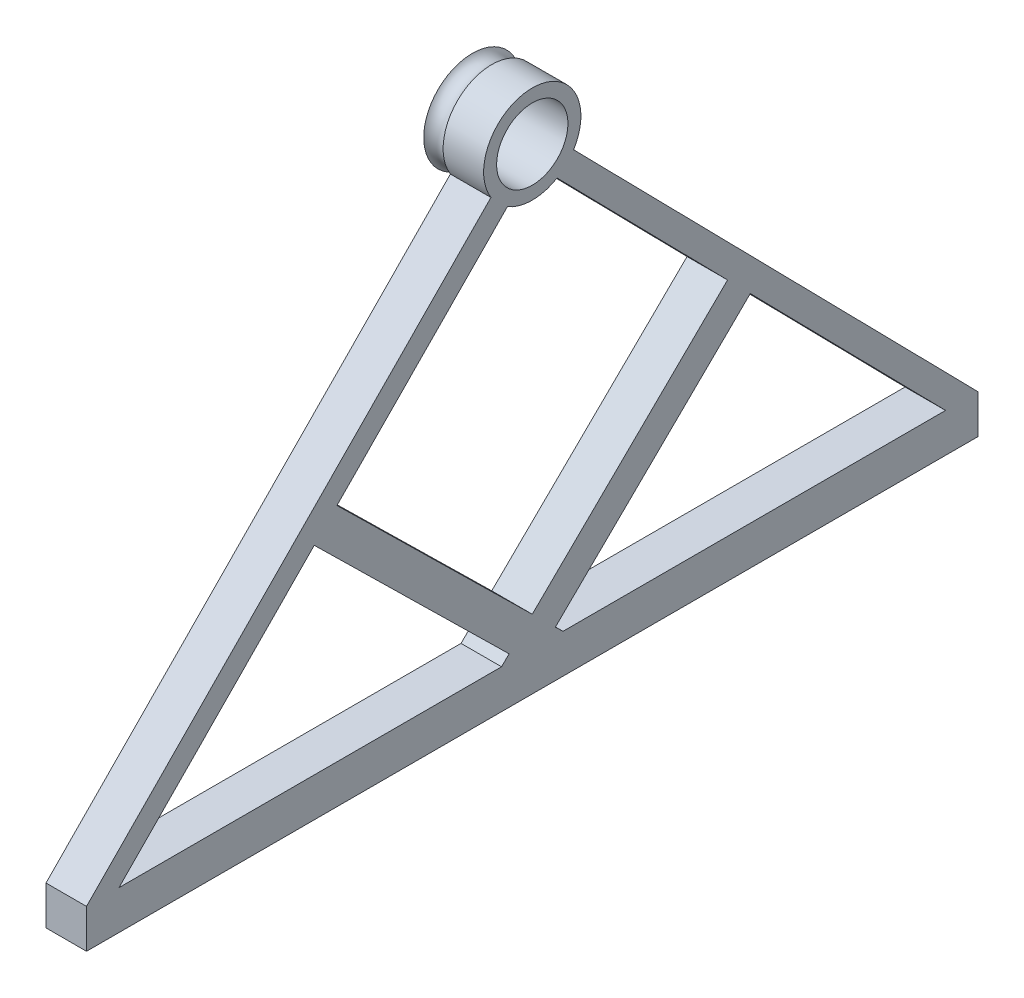
ISO-10303-21;
HEADER;
FILE_DESCRIPTION(('STEP AP214'),'2;1');
FILE_NAME('part.step','',(''),(''),'','','');
FILE_SCHEMA(('AUTOMOTIVE_DESIGN { 1 0 10303 214 1 1 1 1 }'));
ENDSEC;
DATA;
#1=APPLICATION_CONTEXT('core data for automotive mechanical design processes');
#2=APPLICATION_PROTOCOL_DEFINITION('international standard','automotive_design',2000,#1);
#3=PRODUCT_CONTEXT('',#1,'mechanical');
#4=PRODUCT('Part','Part','',(#3));
#5=PRODUCT_RELATED_PRODUCT_CATEGORY('part','',(#4));
#6=PRODUCT_DEFINITION_FORMATION('','',#4);
#7=PRODUCT_DEFINITION_CONTEXT('part definition',#1,'design');
#8=PRODUCT_DEFINITION('design','',#6,#7);
#9=PRODUCT_DEFINITION_SHAPE('','',#8);
#10=(LENGTH_UNIT() NAMED_UNIT(*) SI_UNIT(.MILLI.,.METRE.));
#11=(NAMED_UNIT(*) PLANE_ANGLE_UNIT() SI_UNIT($,.RADIAN.));
#12=(NAMED_UNIT(*) SI_UNIT($,.STERADIAN.) SOLID_ANGLE_UNIT());
#13=UNCERTAINTY_MEASURE_WITH_UNIT(LENGTH_MEASURE(1.E-05),#10,'distance_accuracy_value','');
#14=(GEOMETRIC_REPRESENTATION_CONTEXT(3) GLOBAL_UNCERTAINTY_ASSIGNED_CONTEXT((#13)) GLOBAL_UNIT_ASSIGNED_CONTEXT((#10,
#11,#12)) REPRESENTATION_CONTEXT('',''));
#15=CARTESIAN_POINT('',(0.,0.,0.));
#16=DIRECTION('',(0.,0.,1.));
#17=DIRECTION('',(1.,0.,0.));
#18=AXIS2_PLACEMENT_3D('',#15,#16,#17);
#19=CARTESIAN_POINT('',(152.5,12.,125.));
#20=DIRECTION('',(-1.,0.,0.));
#21=DIRECTION('',(0.,0.,1.));
#22=AXIS2_PLACEMENT_3D('',#19,#20,#21);
#23=PLANE('',#22);
#24=DIRECTION('',(0.,0.713448160609422,-0.700708014884254));
#25=VECTOR('',#24,1.);
#26=CARTESIAN_POINT('',(152.5,12.,127.5));
#27=LINE('',#26,#25);
#28=CARTESIAN_POINT('',(152.5,12.,127.5));
#29=VERTEX_POINT('',#28);
#30=CARTESIAN_POINT('',(152.5,73.3418501060439,67.2535400744212));
#31=VERTEX_POINT('',#30);
#32=EDGE_CURVE('E296',#29,#31,#27,.T.);
#33=ORIENTED_EDGE('',*,*,#32,.F.);
#34=DIRECTION('',(0.,0.,-1.));
#35=VECTOR('',#34,1.);
#36=CARTESIAN_POINT('',(152.5,12.,125.));
#37=LINE('',#36,#35);
#38=CARTESIAN_POINT('',(152.5,12.,9.47489599950741));
#39=VERTEX_POINT('',#38);
#40=EDGE_CURVE('E199',#29,#39,#37,.T.);
#41=ORIENTED_EDGE('',*,*,#40,.T.);
#42=DIRECTION('',(0.,0.700708014884254,-0.713448160609422));
#43=VECTOR('',#42,1.);
#44=CARTESIAN_POINT('',(152.5,1.95493491441996,19.702598632098));
#45=LINE('',#44,#43);
#46=CARTESIAN_POINT('',(152.5,14.2974837662339,7.13563980116018));
#47=VERTEX_POINT('',#46);
#48=EDGE_CURVE('E237',#39,#47,#45,.T.);
#49=ORIENTED_EDGE('',*,*,#48,.T.);
#50=DIRECTION('',(0.,0.700708014884254,0.713448160609422));
#51=VECTOR('',#50,1.);
#52=CARTESIAN_POINT('',(152.5,-5.17954669167424,-12.6955184832554));
#53=LINE('',#52,#51);
#54=EDGE_CURVE('E250',#47,#31,#53,.T.);
#55=ORIENTED_EDGE('',*,*,#54,.T.);
#56=EDGE_LOOP('',(#33,#41,#49,#55));
#57=FACE_BOUND('',#56,.T.);
#58=DIRECTION('',(0.,0.713448160609422,0.700708014884254));
#59=VECTOR('',#58,1.);
#60=CARTESIAN_POINT('',(152.5,152.,0.));
#61=LINE('',#60,#59);
#62=CARTESIAN_POINT('',(152.5,12.,-137.5));
#63=VERTEX_POINT('',#62);
#64=CARTESIAN_POINT('',(152.5,139.013992886752,-12.7541141290826));
#65=VERTEX_POINT('',#64);
#66=EDGE_CURVE('E181',#63,#65,#61,.T.);
#67=ORIENTED_EDGE('',*,*,#66,.F.);
#68=DIRECTION('',(0.,-1.,0.));
#69=VECTOR('',#68,1.);
#70=CARTESIAN_POINT('',(152.5,0.,-137.5));
#71=LINE('',#70,#69);
#72=CARTESIAN_POINT('',(152.5,0.,-137.5));
#73=VERTEX_POINT('',#72);
#74=EDGE_CURVE('E184',#63,#73,#71,.T.);
#75=ORIENTED_EDGE('',*,*,#74,.T.);
#76=DIRECTION('',(0.,0.,-1.));
#77=VECTOR('',#76,1.);
#78=CARTESIAN_POINT('',(152.5,0.,125.));
#79=LINE('',#78,#77);
#80=CARTESIAN_POINT('',(152.5,0.,137.5));
#81=VERTEX_POINT('',#80);
#82=EDGE_CURVE('E169',#81,#73,#79,.T.);
#83=ORIENTED_EDGE('',*,*,#82,.F.);
#84=DIRECTION('',(0.,-1.,0.));
#85=VECTOR('',#84,1.);
#86=CARTESIAN_POINT('',(152.5,12.,137.5));
#87=LINE('',#86,#85);
#88=CARTESIAN_POINT('',(152.5,12.,137.5));
#89=VERTEX_POINT('',#88);
#90=EDGE_CURVE('E189',#89,#81,#87,.T.);
#91=ORIENTED_EDGE('',*,*,#90,.F.);
#92=DIRECTION('',(0.,-0.713448160609422,0.700708014884254));
#93=VECTOR('',#92,1.);
#94=CARTESIAN_POINT('',(152.5,152.,0.));
#95=LINE('',#94,#93);
#96=CARTESIAN_POINT('',(152.5,139.013992886752,12.7541141290826));
#97=VERTEX_POINT('',#96);
#98=EDGE_CURVE('E281',#97,#89,#95,.T.);
#99=ORIENTED_EDGE('',*,*,#98,.F.);
#100=CARTESIAN_POINT('',(152.5,146.909090909091,0.));
#101=DIRECTION('',(1.,0.,0.));
#102=DIRECTION('',(0.,0.,-1.));
#103=AXIS2_PLACEMENT_3D('',#100,#101,#102);
#104=CIRCLE('',#103,15.);
#105=CARTESIAN_POINT('',(152.5,134.014804443318,7.66403135031291));
#106=VERTEX_POINT('',#105);
#107=EDGE_CURVE('E328',#97,#106,#104,.T.);
#108=ORIENTED_EDGE('',*,*,#107,.T.);
#109=CARTESIAN_POINT('',(152.5,80.4763317121381,60.2464599255787));
#110=VERTEX_POINT('',#109);
#111=EDGE_CURVE('E299',#110,#106,#27,.T.);
#112=ORIENTED_EDGE('',*,*,#111,.F.);
#113=DIRECTION('',(0.,0.700708014884254,0.713448160609422));
#114=VECTOR('',#113,1.);
#115=CARTESIAN_POINT('',(152.5,1.95493491441998,-19.7025986320979));
#116=LINE('',#115,#114);
#117=CARTESIAN_POINT('',(152.5,21.3057014280876,0.));
#118=VERTEX_POINT('',#117);
#119=EDGE_CURVE('E254',#118,#110,#116,.T.);
#120=ORIENTED_EDGE('',*,*,#119,.F.);
#121=CARTESIAN_POINT('',(152.5,80.4763317121381,-60.2464599255786));
#122=VERTEX_POINT('',#121);
#123=EDGE_CURVE('E228',#118,#122,#45,.T.);
#124=ORIENTED_EDGE('',*,*,#123,.T.);
#125=DIRECTION('',(0.,-0.713448160609422,-0.700708014884254));
#126=VECTOR('',#125,1.);
#127=CARTESIAN_POINT('',(152.5,141.818181818182,0.));
#128=LINE('',#127,#126);
#129=CARTESIAN_POINT('',(152.5,134.014804443318,-7.6640313503129));
#130=VERTEX_POINT('',#129);
#131=EDGE_CURVE('E294',#130,#122,#128,.T.);
#132=ORIENTED_EDGE('',*,*,#131,.F.);
#133=EDGE_CURVE('E326',#130,#65,#104,.T.);
#134=ORIENTED_EDGE('',*,*,#133,.T.);
#135=EDGE_LOOP('',(#67,#75,#83,#91,#99,#108,#112,#120,#124,#132,#134));
#136=FACE_BOUND('',#135,.T.);
#137=CARTESIAN_POINT('',(152.5,12.,-9.47489599950734));
#138=VERTEX_POINT('',#137);
#139=CARTESIAN_POINT('',(152.5,12.,-127.5));
#140=VERTEX_POINT('',#139);
#141=EDGE_CURVE('E180',#138,#140,#37,.T.);
#142=ORIENTED_EDGE('',*,*,#141,.T.);
#143=CARTESIAN_POINT('',(152.5,73.3418501060439,-67.2535400744212));
#144=VERTEX_POINT('',#143);
#145=EDGE_CURVE('E225',#144,#140,#128,.T.);
#146=ORIENTED_EDGE('',*,*,#145,.F.);
#147=DIRECTION('',(0.,0.700708014884254,-0.713448160609422));
#148=VECTOR('',#147,1.);
#149=CARTESIAN_POINT('',(152.5,-5.17954669167427,12.6955184832554));
#150=LINE('',#149,#148);
#151=CARTESIAN_POINT('',(152.5,14.2974837662339,-7.13563980116013));
#152=VERTEX_POINT('',#151);
#153=EDGE_CURVE('E217',#152,#144,#150,.T.);
#154=ORIENTED_EDGE('',*,*,#153,.F.);
#155=EDGE_CURVE('E222',#138,#152,#116,.T.);
#156=ORIENTED_EDGE('',*,*,#155,.F.);
#157=EDGE_LOOP('',(#142,#146,#154,#156));
#158=FACE_BOUND('',#157,.T.);
#159=ADVANCED_FACE('F36',(#57,#136,#158),#23,.T.);
#160=CARTESIAN_POINT('',(-156.085482484189,141.818181818182,0.));
#161=DIRECTION('',(0.,-0.700708014884254,0.713448160609422));
#162=DIRECTION('',(0.,-0.713448160609422,-0.700708014884254));
#163=AXIS2_PLACEMENT_3D('',#160,#161,#162);
#164=PLANE('',#163);
#165=DIRECTION('',(0.,-0.713448160609422,-0.700708014884254));
#166=VECTOR('',#165,1.);
#167=CARTESIAN_POINT('',(165.,141.818181818182,0.));
#168=LINE('',#167,#166);
#169=CARTESIAN_POINT('',(165.,73.3418501060439,-67.2535400744212));
#170=VERTEX_POINT('',#169);
#171=CARTESIAN_POINT('',(165.,12.,-127.5));
#172=VERTEX_POINT('',#171);
#173=EDGE_CURVE('E51',#170,#172,#168,.T.);
#174=ORIENTED_EDGE('',*,*,#173,.F.);
#175=DIRECTION('',(1.,0.,0.));
#176=VECTOR('',#175,1.);
#177=CARTESIAN_POINT('',(0.,73.3418501060439,-67.2535400744212));
#178=LINE('',#177,#176);
#179=EDGE_CURVE('E226',#144,#170,#178,.T.);
#180=ORIENTED_EDGE('',*,*,#179,.F.);
#181=ORIENTED_EDGE('',*,*,#145,.T.);
#182=DIRECTION('',(1.,0.,0.));
#183=VECTOR('',#182,1.);
#184=CARTESIAN_POINT('',(-156.085482484189,12.,-127.5));
#185=LINE('',#184,#183);
#186=EDGE_CURVE('E293',#140,#172,#185,.T.);
#187=ORIENTED_EDGE('',*,*,#186,.T.);
#188=EDGE_LOOP('',(#174,#180,#181,#187));
#189=FACE_BOUND('',#188,.T.);
#190=ADVANCED_FACE('F375',(#189),#164,.T.);
#191=CARTESIAN_POINT('',(0.,1.95493491441998,-19.7025986320979));
#192=DIRECTION('',(0.,-0.713448160609422,0.700708014884254));
#193=DIRECTION('',(0.,-0.700708014884254,-0.713448160609422));
#194=AXIS2_PLACEMENT_3D('',#191,#192,#193);
#195=PLANE('',#194);
#196=DIRECTION('',(-1.,0.,0.));
#197=VECTOR('',#196,1.);
#198=CARTESIAN_POINT('',(0.,14.2974837662339,-7.13563980116013));
#199=LINE('',#198,#197);
#200=CARTESIAN_POINT('',(165.,14.2974837662339,-7.13563980116013));
#201=VERTEX_POINT('',#200);
#202=EDGE_CURVE('E44',#201,#152,#199,.T.);
#203=ORIENTED_EDGE('',*,*,#202,.F.);
#204=DIRECTION('',(0.,0.700708014884254,0.713448160609422));
#205=VECTOR('',#204,1.);
#206=CARTESIAN_POINT('',(165.,1.95493491442002,-19.7025986320979));
#207=LINE('',#206,#205);
#208=CARTESIAN_POINT('',(165.,12.,-9.47489599950735));
#209=VERTEX_POINT('',#208);
#210=EDGE_CURVE('E255',#209,#201,#207,.T.);
#211=ORIENTED_EDGE('',*,*,#210,.F.);
#212=DIRECTION('',(1.,0.,0.));
#213=VECTOR('',#212,1.);
#214=CARTESIAN_POINT('',(0.,12.,-9.47489599950734));
#215=LINE('',#214,#213);
#216=EDGE_CURVE('E242',#138,#209,#215,.T.);
#217=ORIENTED_EDGE('',*,*,#216,.F.);
#218=ORIENTED_EDGE('',*,*,#155,.T.);
#219=EDGE_LOOP('',(#203,#211,#217,#218));
#220=FACE_BOUND('',#219,.T.);
#221=ADVANCED_FACE('F382',(#220),#195,.F.);
#222=CARTESIAN_POINT('',(0.,12.,0.));
#223=DIRECTION('',(0.,-1.,0.));
#224=DIRECTION('',(0.,0.,-1.));
#225=AXIS2_PLACEMENT_3D('',#222,#223,#224);
#226=PLANE('',#225);
#227=ORIENTED_EDGE('',*,*,#40,.F.);
#228=DIRECTION('',(1.,0.,0.));
#229=VECTOR('',#228,1.);
#230=CARTESIAN_POINT('',(-156.085482484189,12.,127.5));
#231=LINE('',#230,#229);
#232=CARTESIAN_POINT('',(165.,12.,127.5));
#233=VERTEX_POINT('',#232);
#234=EDGE_CURVE('E301',#29,#233,#231,.T.);
#235=ORIENTED_EDGE('',*,*,#234,.T.);
#236=DIRECTION('',(0.,0.,-1.));
#237=VECTOR('',#236,1.);
#238=CARTESIAN_POINT('',(165.,12.,137.5));
#239=LINE('',#238,#237);
#240=CARTESIAN_POINT('',(165.,12.,9.47489599950741));
#241=VERTEX_POINT('',#240);
#242=EDGE_CURVE('E307',#233,#241,#239,.T.);
#243=ORIENTED_EDGE('',*,*,#242,.T.);
#244=DIRECTION('',(1.,0.,0.));
#245=VECTOR('',#244,1.);
#246=CARTESIAN_POINT('',(0.,12.,9.47489599950728));
#247=LINE('',#246,#245);
#248=EDGE_CURVE('E233',#39,#241,#247,.T.);
#249=ORIENTED_EDGE('',*,*,#248,.F.);
#250=EDGE_LOOP('',(#227,#235,#243,#249));
#251=FACE_BOUND('',#250,.T.);
#252=ADVANCED_FACE('F393',(#251),#226,.F.);
#253=CARTESIAN_POINT('',(-156.085482484189,12.,127.5));
#254=DIRECTION('',(0.,-0.700708014884254,-0.713448160609422));
#255=DIRECTION('',(0.,0.713448160609422,-0.700708014884254));
#256=AXIS2_PLACEMENT_3D('',#253,#254,#255);
#257=PLANE('',#256);
#258=DIRECTION('',(0.,0.713448160609422,-0.700708014884254));
#259=VECTOR('',#258,1.);
#260=CARTESIAN_POINT('',(165.,12.,127.5));
#261=LINE('',#260,#259);
#262=CARTESIAN_POINT('',(165.,80.4763317121381,60.2464599255786));
#263=VERTEX_POINT('',#262);
#264=CARTESIAN_POINT('',(165.,134.014804443318,7.66403135031291));
#265=VERTEX_POINT('',#264);
#266=EDGE_CURVE('E285',#263,#265,#261,.T.);
#267=ORIENTED_EDGE('',*,*,#266,.F.);
#268=DIRECTION('',(1.,0.,0.));
#269=VECTOR('',#268,1.);
#270=CARTESIAN_POINT('',(0.,80.4763317121381,60.2464599255787));
#271=LINE('',#270,#269);
#272=EDGE_CURVE('E247',#110,#263,#271,.T.);
#273=ORIENTED_EDGE('',*,*,#272,.F.);
#274=ORIENTED_EDGE('',*,*,#111,.T.);
#275=DIRECTION('',(-1.,0.,0.));
#276=VECTOR('',#275,1.);
#277=CARTESIAN_POINT('',(207.426406871193,134.014804443318,7.66403135031289));
#278=LINE('',#277,#276);
#279=EDGE_CURVE('E273',#265,#106,#278,.T.);
#280=ORIENTED_EDGE('',*,*,#279,.F.);
#281=EDGE_LOOP('',(#267,#273,#274,#280));
#282=FACE_BOUND('',#281,.T.);
#283=ADVANCED_FACE('F391',(#282),#257,.T.);
#284=ORIENTED_EDGE('',*,*,#186,.F.);
#285=ORIENTED_EDGE('',*,*,#141,.F.);
#286=ORIENTED_EDGE('',*,*,#216,.T.);
#287=EDGE_CURVE('E197',#209,#172,#239,.T.);
#288=ORIENTED_EDGE('',*,*,#287,.T.);
#289=EDGE_LOOP('',(#284,#285,#286,#288));
#290=FACE_BOUND('',#289,.T.);
#291=ADVANCED_FACE('F388',(#290),#226,.F.);
#292=CARTESIAN_POINT('',(0.,0.,0.));
#293=DIRECTION('',(0.,-1.,0.));
#294=DIRECTION('',(0.,0.,-1.));
#295=AXIS2_PLACEMENT_3D('',#292,#293,#294);
#296=PLANE('',#295);
#297=ORIENTED_EDGE('',*,*,#82,.T.);
#298=DIRECTION('',(-1.,0.,0.));
#299=VECTOR('',#298,1.);
#300=CARTESIAN_POINT('',(-165.,0.,-137.5));
#301=LINE('',#300,#299);
#302=CARTESIAN_POINT('',(165.,0.,-137.5));
#303=VERTEX_POINT('',#302);
#304=EDGE_CURVE('E174',#303,#73,#301,.T.);
#305=ORIENTED_EDGE('',*,*,#304,.F.);
#306=DIRECTION('',(0.,0.,-1.));
#307=VECTOR('',#306,1.);
#308=CARTESIAN_POINT('',(165.,0.,137.5));
#309=LINE('',#308,#307);
#310=CARTESIAN_POINT('',(165.,0.,137.5));
#311=VERTEX_POINT('',#310);
#312=EDGE_CURVE('E195',#311,#303,#309,.T.);
#313=ORIENTED_EDGE('',*,*,#312,.F.);
#314=DIRECTION('',(1.,0.,0.));
#315=VECTOR('',#314,1.);
#316=CARTESIAN_POINT('',(-165.,0.,137.5));
#317=LINE('',#316,#315);
#318=EDGE_CURVE('E176',#81,#311,#317,.T.);
#319=ORIENTED_EDGE('',*,*,#318,.F.);
#320=EDGE_LOOP('',(#297,#305,#313,#319));
#321=FACE_BOUND('',#320,.T.);
#322=ADVANCED_FACE('F171',(#321),#296,.T.);
#323=CARTESIAN_POINT('',(165.,12.,137.5));
#324=DIRECTION('',(-1.,0.,0.));
#325=DIRECTION('',(0.,0.,1.));
#326=AXIS2_PLACEMENT_3D('',#323,#324,#325);
#327=PLANE('',#326);
#328=DIRECTION('',(0.,0.700708014884254,-0.713448160609422));
#329=VECTOR('',#328,1.);
#330=CARTESIAN_POINT('',(165.,1.95493491441998,19.702598632098));
#331=LINE('',#330,#329);
#332=CARTESIAN_POINT('',(165.,14.2974837662339,7.13563980116018));
#333=VERTEX_POINT('',#332);
#334=EDGE_CURVE('E230',#241,#333,#331,.T.);
#335=ORIENTED_EDGE('',*,*,#334,.F.);
#336=ORIENTED_EDGE('',*,*,#242,.F.);
#337=CARTESIAN_POINT('',(165.,73.3418501060439,67.2535400744212));
#338=VERTEX_POINT('',#337);
#339=EDGE_CURVE('E282',#233,#338,#261,.T.);
#340=ORIENTED_EDGE('',*,*,#339,.T.);
#341=DIRECTION('',(0.,0.700708014884254,0.713448160609422));
#342=VECTOR('',#341,1.);
#343=CARTESIAN_POINT('',(165.,-5.17954669167424,-12.6955184832554));
#344=LINE('',#343,#342);
#345=EDGE_CURVE('E246',#333,#338,#344,.T.);
#346=ORIENTED_EDGE('',*,*,#345,.F.);
#347=EDGE_LOOP('',(#335,#336,#340,#346));
#348=FACE_BOUND('',#347,.T.);
#349=CARTESIAN_POINT('',(165.,21.3057014280876,0.));
#350=VERTEX_POINT('',#349);
#351=CARTESIAN_POINT('',(165.,80.4763317121381,-60.2464599255786));
#352=VERTEX_POINT('',#351);
#353=EDGE_CURVE('E236',#350,#352,#331,.T.);
#354=ORIENTED_EDGE('',*,*,#353,.F.);
#355=EDGE_CURVE('E257',#350,#263,#207,.T.);
#356=ORIENTED_EDGE('',*,*,#355,.T.);
#357=ORIENTED_EDGE('',*,*,#266,.T.);
#358=CARTESIAN_POINT('',(165.,146.909090909091,0.));
#359=DIRECTION('',(-1.,0.,0.));
#360=DIRECTION('',(0.,0.,1.));
#361=AXIS2_PLACEMENT_3D('',#358,#359,#360);
#362=CIRCLE('',#361,15.);
#363=CARTESIAN_POINT('',(165.,134.014804443318,-7.66403135031291));
#364=VERTEX_POINT('',#363);
#365=EDGE_CURVE('E263',#265,#364,#362,.F.);
#366=ORIENTED_EDGE('',*,*,#365,.T.);
#367=EDGE_CURVE('E279',#364,#352,#168,.T.);
#368=ORIENTED_EDGE('',*,*,#367,.T.);
#369=EDGE_LOOP('',(#354,#356,#357,#366,#368));
#370=FACE_BOUND('',#369,.T.);
#371=ORIENTED_EDGE('',*,*,#210,.T.);
#372=DIRECTION('',(0.,0.700708014884254,-0.713448160609422));
#373=VECTOR('',#372,1.);
#374=CARTESIAN_POINT('',(165.,-5.17954669167425,12.6955184832554));
#375=LINE('',#374,#373);
#376=EDGE_CURVE('E218',#201,#170,#375,.T.);
#377=ORIENTED_EDGE('',*,*,#376,.T.);
#378=ORIENTED_EDGE('',*,*,#173,.T.);
#379=ORIENTED_EDGE('',*,*,#287,.F.);
#380=EDGE_LOOP('',(#371,#377,#378,#379));
#381=FACE_BOUND('',#380,.T.);
#382=DIRECTION('',(0.,0.713448160609422,0.700708014884254));
#383=VECTOR('',#382,1.);
#384=CARTESIAN_POINT('',(165.,152.,0.));
#385=LINE('',#384,#383);
#386=CARTESIAN_POINT('',(165.,12.,-137.5));
#387=VERTEX_POINT('',#386);
#388=CARTESIAN_POINT('',(165.,139.013992886752,-12.7541141290826));
#389=VERTEX_POINT('',#388);
#390=EDGE_CURVE('E278',#387,#389,#385,.T.);
#391=ORIENTED_EDGE('',*,*,#390,.T.);
#392=CARTESIAN_POINT('',(165.,139.013992886752,12.7541141290826));
#393=VERTEX_POINT('',#392);
#394=EDGE_CURVE('E261',#389,#393,#362,.F.);
#395=ORIENTED_EDGE('',*,*,#394,.T.);
#396=DIRECTION('',(0.,-0.713448160609422,0.700708014884254));
#397=VECTOR('',#396,1.);
#398=CARTESIAN_POINT('',(165.,152.,0.));
#399=LINE('',#398,#397);
#400=CARTESIAN_POINT('',(165.,12.,137.5));
#401=VERTEX_POINT('',#400);
#402=EDGE_CURVE('E286',#393,#401,#399,.T.);
#403=ORIENTED_EDGE('',*,*,#402,.T.);
#404=DIRECTION('',(0.,-1.,0.));
#405=VECTOR('',#404,1.);
#406=CARTESIAN_POINT('',(165.,12.,137.5));
#407=LINE('',#406,#405);
#408=EDGE_CURVE('E203',#401,#311,#407,.T.);
#409=ORIENTED_EDGE('',*,*,#408,.T.);
#410=ORIENTED_EDGE('',*,*,#312,.T.);
#411=DIRECTION('',(0.,-1.,0.));
#412=VECTOR('',#411,1.);
#413=CARTESIAN_POINT('',(165.,12.,-137.5));
#414=LINE('',#413,#412);
#415=EDGE_CURVE('E193',#387,#303,#414,.T.);
#416=ORIENTED_EDGE('',*,*,#415,.F.);
#417=EDGE_LOOP('',(#391,#395,#403,#409,#410,#416));
#418=FACE_BOUND('',#417,.T.);
#419=CARTESIAN_POINT('',(165.,146.909090909091,0.));
#420=DIRECTION('',(-1.,0.,0.));
#421=DIRECTION('',(0.,0.,1.));
#422=AXIS2_PLACEMENT_3D('',#419,#420,#421);
#423=CIRCLE('',#422,11.);
#424=CARTESIAN_POINT('',(165.,146.909090909091,11.));
#425=VERTEX_POINT('',#424);
#426=EDGE_CURVE('E267',#425,#425,#423,.F.);
#427=ORIENTED_EDGE('',*,*,#426,.F.);
#428=EDGE_LOOP('',(#427));
#429=FACE_BOUND('',#428,.T.);
#430=ADVANCED_FACE('F38',(#348,#370,#381,#418,#429),#327,.F.);
#431=CARTESIAN_POINT('',(-165.,12.,-137.5));
#432=DIRECTION('',(0.,0.,1.));
#433=DIRECTION('',(1.,0.,0.));
#434=AXIS2_PLACEMENT_3D('',#431,#432,#433);
#435=PLANE('',#434);
#436=ORIENTED_EDGE('',*,*,#304,.T.);
#437=ORIENTED_EDGE('',*,*,#74,.F.);
#438=DIRECTION('',(-1.,0.,0.));
#439=VECTOR('',#438,1.);
#440=CARTESIAN_POINT('',(-165.,12.,-137.5));
#441=LINE('',#440,#439);
#442=EDGE_CURVE('E206',#387,#63,#441,.T.);
#443=ORIENTED_EDGE('',*,*,#442,.F.);
#444=ORIENTED_EDGE('',*,*,#415,.T.);
#445=EDGE_LOOP('',(#436,#437,#443,#444));
#446=FACE_BOUND('',#445,.T.);
#447=ADVANCED_FACE('F191',(#446),#435,.F.);
#448=CARTESIAN_POINT('',(-165.,12.,137.5));
#449=DIRECTION('',(0.,0.,-1.));
#450=DIRECTION('',(-1.,0.,0.));
#451=AXIS2_PLACEMENT_3D('',#448,#449,#450);
#452=PLANE('',#451);
#453=DIRECTION('',(1.,0.,0.));
#454=VECTOR('',#453,1.);
#455=CARTESIAN_POINT('',(-156.085482484189,12.,137.5));
#456=LINE('',#455,#454);
#457=EDGE_CURVE('E291',#89,#401,#456,.T.);
#458=ORIENTED_EDGE('',*,*,#457,.F.);
#459=ORIENTED_EDGE('',*,*,#90,.T.);
#460=ORIENTED_EDGE('',*,*,#318,.T.);
#461=ORIENTED_EDGE('',*,*,#408,.F.);
#462=EDGE_LOOP('',(#458,#459,#460,#461));
#463=FACE_BOUND('',#462,.T.);
#464=ADVANCED_FACE('F319',(#463),#452,.F.);
#465=CARTESIAN_POINT('',(-156.085482484189,152.,0.));
#466=DIRECTION('',(0.,0.700708014884254,0.713448160609422));
#467=DIRECTION('',(0.,-0.713448160609422,0.700708014884254));
#468=AXIS2_PLACEMENT_3D('',#465,#466,#467);
#469=PLANE('',#468);
#470=DIRECTION('',(-1.,0.,0.));
#471=VECTOR('',#470,1.);
#472=CARTESIAN_POINT('',(207.426406871193,139.013992886752,12.7541141290826));
#473=LINE('',#472,#471);
#474=EDGE_CURVE('E275',#97,#393,#473,.F.);
#475=ORIENTED_EDGE('',*,*,#474,.F.);
#476=ORIENTED_EDGE('',*,*,#98,.T.);
#477=ORIENTED_EDGE('',*,*,#457,.T.);
#478=ORIENTED_EDGE('',*,*,#402,.F.);
#479=EDGE_LOOP('',(#475,#476,#477,#478));
#480=FACE_BOUND('',#479,.T.);
#481=ADVANCED_FACE('F322',(#480),#469,.T.);
#482=DIRECTION('',(1.,0.,0.));
#483=VECTOR('',#482,1.);
#484=CARTESIAN_POINT('',(0.,73.3418501060439,67.2535400744212));
#485=LINE('',#484,#483);
#486=EDGE_CURVE('E243',#31,#338,#485,.T.);
#487=ORIENTED_EDGE('',*,*,#486,.T.);
#488=ORIENTED_EDGE('',*,*,#339,.F.);
#489=ORIENTED_EDGE('',*,*,#234,.F.);
#490=ORIENTED_EDGE('',*,*,#32,.T.);
#491=EDGE_LOOP('',(#487,#488,#489,#490));
#492=FACE_BOUND('',#491,.T.);
#493=ADVANCED_FACE('F416',(#492),#257,.T.);
#494=DIRECTION('',(1.,0.,0.));
#495=VECTOR('',#494,1.);
#496=CARTESIAN_POINT('',(0.,80.4763317121381,-60.2464599255787));
#497=LINE('',#496,#495);
#498=EDGE_CURVE('E59',#122,#352,#497,.T.);
#499=ORIENTED_EDGE('',*,*,#498,.T.);
#500=ORIENTED_EDGE('',*,*,#367,.F.);
#501=DIRECTION('',(-1.,0.,0.));
#502=VECTOR('',#501,1.);
#503=CARTESIAN_POINT('',(207.426406871193,134.014804443318,-7.6640313503129));
#504=LINE('',#503,#502);
#505=EDGE_CURVE('E270',#130,#364,#504,.F.);
#506=ORIENTED_EDGE('',*,*,#505,.F.);
#507=ORIENTED_EDGE('',*,*,#131,.T.);
#508=EDGE_LOOP('',(#499,#500,#506,#507));
#509=FACE_BOUND('',#508,.T.);
#510=ADVANCED_FACE('F351',(#509),#164,.T.);
#511=CARTESIAN_POINT('',(-156.085482484189,152.,0.));
#512=DIRECTION('',(0.,0.700708014884254,-0.713448160609422));
#513=DIRECTION('',(0.,0.713448160609422,0.700708014884254));
#514=AXIS2_PLACEMENT_3D('',#511,#512,#513);
#515=PLANE('',#514);
#516=DIRECTION('',(-1.,0.,0.));
#517=VECTOR('',#516,1.);
#518=CARTESIAN_POINT('',(207.426406871193,139.013992886752,-12.7541141290826));
#519=LINE('',#518,#517);
#520=EDGE_CURVE('E208',#389,#65,#519,.T.);
#521=ORIENTED_EDGE('',*,*,#520,.F.);
#522=ORIENTED_EDGE('',*,*,#390,.F.);
#523=ORIENTED_EDGE('',*,*,#442,.T.);
#524=ORIENTED_EDGE('',*,*,#66,.T.);
#525=EDGE_LOOP('',(#521,#522,#523,#524));
#526=FACE_BOUND('',#525,.T.);
#527=ADVANCED_FACE('F312',(#526),#515,.T.);
#528=CARTESIAN_POINT('',(207.426406871193,146.909090909091,0.));
#529=DIRECTION('',(-1.,0.,0.));
#530=DIRECTION('',(0.,0.,1.));
#531=AXIS2_PLACEMENT_3D('',#528,#529,#530);
#532=CYLINDRICAL_SURFACE('',#531,11.);
#533=ORIENTED_EDGE('',*,*,#426,.T.);
#534=EDGE_LOOP('',(#533));
#535=FACE_BOUND('',#534,.T.);
#536=CARTESIAN_POINT('',(146.516872170501,146.909090909091,0.));
#537=DIRECTION('',(1.,0.,0.));
#538=DIRECTION('',(0.,0.,-1.));
#539=AXIS2_PLACEMENT_3D('',#536,#537,#538);
#540=CIRCLE('',#539,11.);
#541=CARTESIAN_POINT('',(146.516872170501,146.909090909091,-11.));
#542=VERTEX_POINT('',#541);
#543=EDGE_CURVE('E331',#542,#542,#540,.T.);
#544=ORIENTED_EDGE('',*,*,#543,.F.);
#545=EDGE_LOOP('',(#544));
#546=FACE_BOUND('',#545,.T.);
#547=ADVANCED_FACE('F363',(#535,#546),#532,.F.);
#548=CARTESIAN_POINT('',(207.426406871193,146.909090909091,0.));
#549=DIRECTION('',(-1.,0.,0.));
#550=DIRECTION('',(0.,0.,1.));
#551=AXIS2_PLACEMENT_3D('',#548,#549,#550);
#552=CYLINDRICAL_SURFACE('',#551,15.);
#553=CARTESIAN_POINT('',(152.5,146.909090909091,0.));
#554=DIRECTION('',(-1.,0.,0.));
#555=DIRECTION('',(0.,0.,1.));
#556=AXIS2_PLACEMENT_3D('',#553,#554,#555);
#557=CIRCLE('',#556,15.);
#558=EDGE_CURVE('E260',#97,#65,#557,.T.);
#559=ORIENTED_EDGE('',*,*,#558,.F.);
#560=ORIENTED_EDGE('',*,*,#474,.T.);
#561=ORIENTED_EDGE('',*,*,#394,.F.);
#562=ORIENTED_EDGE('',*,*,#520,.T.);
#563=EDGE_LOOP('',(#559,#560,#561,#562));
#564=FACE_BOUND('',#563,.T.);
#565=ADVANCED_FACE('F360',(#564),#552,.T.);
#566=ORIENTED_EDGE('',*,*,#365,.F.);
#567=ORIENTED_EDGE('',*,*,#279,.T.);
#568=EDGE_CURVE('E264',#130,#106,#557,.T.);
#569=ORIENTED_EDGE('',*,*,#568,.F.);
#570=ORIENTED_EDGE('',*,*,#505,.T.);
#571=EDGE_LOOP('',(#566,#567,#569,#570));
#572=FACE_BOUND('',#571,.T.);
#573=ADVANCED_FACE('F362',(#572),#552,.T.);
#574=CARTESIAN_POINT('',(0.,-5.17954669167424,-12.6955184832554));
#575=DIRECTION('',(0.,-0.713448160609422,0.700708014884254));
#576=DIRECTION('',(0.,-0.700708014884254,-0.713448160609422));
#577=AXIS2_PLACEMENT_3D('',#574,#575,#576);
#578=PLANE('',#577);
#579=DIRECTION('',(-1.,0.,0.));
#580=VECTOR('',#579,1.);
#581=CARTESIAN_POINT('',(0.,14.2974837662338,7.1356398011601));
#582=LINE('',#581,#580);
#583=EDGE_CURVE('E239',#333,#47,#582,.T.);
#584=ORIENTED_EDGE('',*,*,#583,.F.);
#585=ORIENTED_EDGE('',*,*,#345,.T.);
#586=ORIENTED_EDGE('',*,*,#486,.F.);
#587=ORIENTED_EDGE('',*,*,#54,.F.);
#588=EDGE_LOOP('',(#584,#585,#586,#587));
#589=FACE_BOUND('',#588,.T.);
#590=ADVANCED_FACE('F369',(#589),#578,.T.);
#591=ORIENTED_EDGE('',*,*,#355,.F.);
#592=DIRECTION('',(-1.,0.,0.));
#593=VECTOR('',#592,1.);
#594=CARTESIAN_POINT('',(0.,21.3057014280875,0.));
#595=LINE('',#594,#593);
#596=EDGE_CURVE('E11',#350,#118,#595,.T.);
#597=ORIENTED_EDGE('',*,*,#596,.T.);
#598=ORIENTED_EDGE('',*,*,#119,.T.);
#599=ORIENTED_EDGE('',*,*,#272,.T.);
#600=EDGE_LOOP('',(#591,#597,#598,#599));
#601=FACE_BOUND('',#600,.T.);
#602=ADVANCED_FACE('F424',(#601),#195,.F.);
#603=CARTESIAN_POINT('',(0.,-5.17954669167427,12.6955184832554));
#604=DIRECTION('',(0.,0.713448160609422,0.700708014884254));
#605=DIRECTION('',(0.,-0.700708014884254,0.713448160609422));
#606=AXIS2_PLACEMENT_3D('',#603,#604,#605);
#607=PLANE('',#606);
#608=ORIENTED_EDGE('',*,*,#376,.F.);
#609=ORIENTED_EDGE('',*,*,#202,.T.);
#610=ORIENTED_EDGE('',*,*,#153,.T.);
#611=ORIENTED_EDGE('',*,*,#179,.T.);
#612=EDGE_LOOP('',(#608,#609,#610,#611));
#613=FACE_BOUND('',#612,.T.);
#614=ADVANCED_FACE('F215',(#613),#607,.F.);
#615=CARTESIAN_POINT('',(0.,1.95493491441991,19.7025986320979));
#616=DIRECTION('',(0.,0.713448160609422,0.700708014884254));
#617=DIRECTION('',(0.,-0.700708014884254,0.713448160609422));
#618=AXIS2_PLACEMENT_3D('',#615,#616,#617);
#619=PLANE('',#618);
#620=ORIENTED_EDGE('',*,*,#596,.F.);
#621=ORIENTED_EDGE('',*,*,#353,.T.);
#622=ORIENTED_EDGE('',*,*,#498,.F.);
#623=ORIENTED_EDGE('',*,*,#123,.F.);
#624=EDGE_LOOP('',(#620,#621,#622,#623));
#625=FACE_BOUND('',#624,.T.);
#626=ADVANCED_FACE('F344',(#625),#619,.T.);
#627=ORIENTED_EDGE('',*,*,#334,.T.);
#628=ORIENTED_EDGE('',*,*,#583,.T.);
#629=ORIENTED_EDGE('',*,*,#48,.F.);
#630=ORIENTED_EDGE('',*,*,#248,.T.);
#631=EDGE_LOOP('',(#627,#628,#629,#630));
#632=FACE_BOUND('',#631,.T.);
#633=ADVANCED_FACE('F410',(#632),#619,.T.);
#634=CARTESIAN_POINT('',(149.508436085251,146.909090909091,0.));
#635=DIRECTION('',(1.,0.,0.));
#636=DIRECTION('',(0.,0.,-1.));
#637=AXIS2_PLACEMENT_3D('',#634,#635,#636);
#638=TOROIDAL_SURFACE('',#637,16.8897822772111,3.53846459799895);
#639=ORIENTED_EDGE('',*,*,#107,.F.);
#640=ORIENTED_EDGE('',*,*,#558,.T.);
#641=ORIENTED_EDGE('',*,*,#133,.F.);
#642=ORIENTED_EDGE('',*,*,#568,.T.);
#643=EDGE_LOOP('',(#639,#640,#641,#642));
#644=FACE_BOUND('',#643,.T.);
#645=CARTESIAN_POINT('',(146.516872170501,146.909090909091,0.));
#646=DIRECTION('',(1.,0.,0.));
#647=DIRECTION('',(0.,0.,-1.));
#648=AXIS2_PLACEMENT_3D('',#645,#646,#647);
#649=CIRCLE('',#648,15.);
#650=CARTESIAN_POINT('',(146.516872170501,146.909090909091,-15.));
#651=VERTEX_POINT('',#650);
#652=EDGE_CURVE('E334',#651,#651,#649,.T.);
#653=ORIENTED_EDGE('',*,*,#652,.T.);
#654=EDGE_LOOP('',(#653));
#655=FACE_BOUND('',#654,.T.);
#656=ADVANCED_FACE('F357',(#644,#655),#638,.F.);
#657=CARTESIAN_POINT('',(146.516872170501,0.,0.));
#658=DIRECTION('',(-1.,0.,0.));
#659=DIRECTION('',(0.,0.,1.));
#660=AXIS2_PLACEMENT_3D('',#657,#658,#659);
#661=PLANE('',#660);
#662=ORIENTED_EDGE('',*,*,#543,.T.);
#663=EDGE_LOOP('',(#662));
#664=FACE_BOUND('',#663,.T.);
#665=ORIENTED_EDGE('',*,*,#652,.F.);
#666=EDGE_LOOP('',(#665));
#667=FACE_BOUND('',#666,.T.);
#668=ADVANCED_FACE('F473',(#664,#667),#661,.T.);
#669=CLOSED_SHELL('',(#159,#190,#221,#252,#283,#291,#322,#430,#447,#464,#481,#493,#510,#527,
#547,#565,#573,#590,#602,#614,#626,#633,#656,#668));
#670=MANIFOLD_SOLID_BREP('B2',#669);
#671=ADVANCED_BREP_SHAPE_REPRESENTATION('',(#18,#670),#14);
#672=SHAPE_DEFINITION_REPRESENTATION(#9,#671);
ENDSEC;
END-ISO-10303-21;
